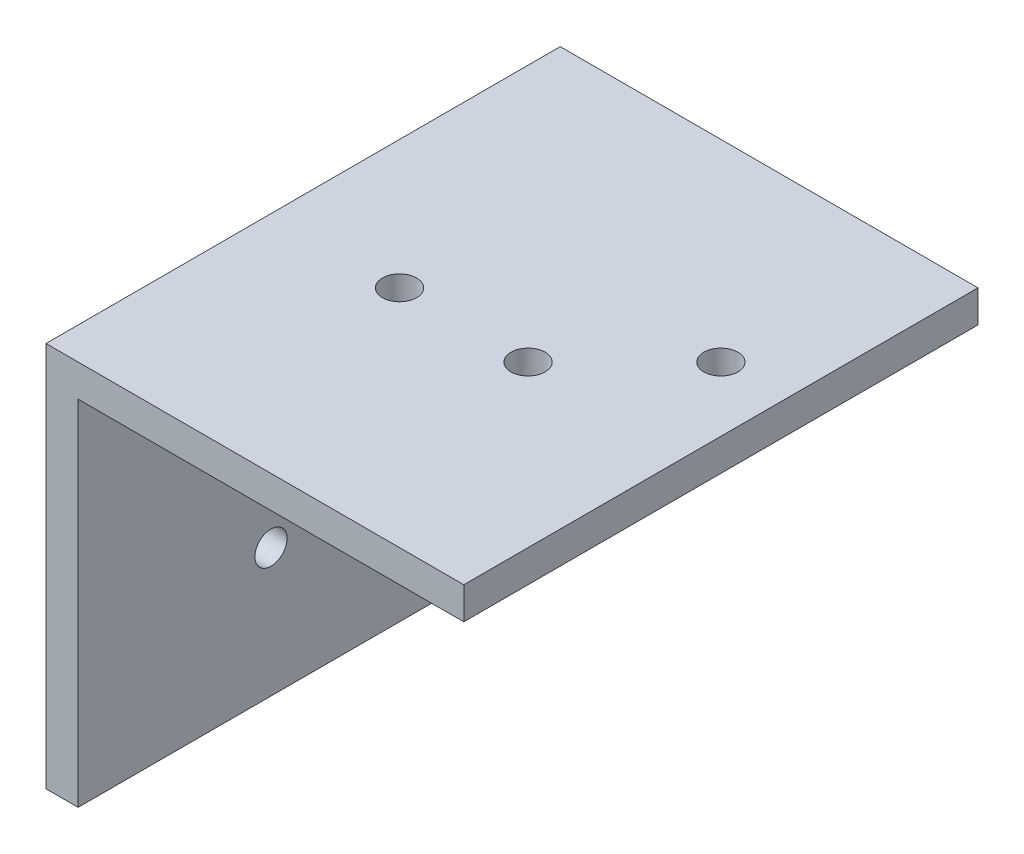
ISO-10303-21;
HEADER;
FILE_DESCRIPTION(('STEP AP214'),'2;1');
FILE_NAME('part.step','',(''),(''),'','','');
FILE_SCHEMA(('AUTOMOTIVE_DESIGN { 1 0 10303 214 1 1 1 1 }'));
ENDSEC;
DATA;
#1=APPLICATION_CONTEXT('core data for automotive mechanical design processes');
#2=APPLICATION_PROTOCOL_DEFINITION('international standard','automotive_design',2000,#1);
#3=PRODUCT_CONTEXT('',#1,'mechanical');
#4=PRODUCT('Part','Part','',(#3));
#5=PRODUCT_RELATED_PRODUCT_CATEGORY('part','',(#4));
#6=PRODUCT_DEFINITION_FORMATION('','',#4);
#7=PRODUCT_DEFINITION_CONTEXT('part definition',#1,'design');
#8=PRODUCT_DEFINITION('design','',#6,#7);
#9=PRODUCT_DEFINITION_SHAPE('','',#8);
#10=(LENGTH_UNIT() NAMED_UNIT(*) SI_UNIT(.MILLI.,.METRE.));
#11=(NAMED_UNIT(*) PLANE_ANGLE_UNIT() SI_UNIT($,.RADIAN.));
#12=(NAMED_UNIT(*) SI_UNIT($,.STERADIAN.) SOLID_ANGLE_UNIT());
#13=UNCERTAINTY_MEASURE_WITH_UNIT(LENGTH_MEASURE(1.E-05),#10,'distance_accuracy_value','');
#14=(GEOMETRIC_REPRESENTATION_CONTEXT(3) GLOBAL_UNCERTAINTY_ASSIGNED_CONTEXT((#13)) GLOBAL_UNIT_ASSIGNED_CONTEXT((#10,
#11,#12)) REPRESENTATION_CONTEXT('',''));
#15=CARTESIAN_POINT('',(0.,0.,0.));
#16=DIRECTION('',(0.,0.,1.));
#17=DIRECTION('',(1.,0.,0.));
#18=AXIS2_PLACEMENT_3D('',#15,#16,#17);
#19=CARTESIAN_POINT('',(33.8636711347438,151.471127611832,-40.704036640267));
#20=DIRECTION('',(0.,-1.,0.));
#21=DIRECTION('',(0.,0.,-1.));
#22=AXIS2_PLACEMENT_3D('',#19,#20,#21);
#23=CYLINDRICAL_SURFACE('',#22,3.3782);
#24=CARTESIAN_POINT('',(33.8636711347438,6.35,-40.704036640267));
#25=DIRECTION('',(0.,-1.,0.));
#26=DIRECTION('',(0.,0.,-1.));
#27=AXIS2_PLACEMENT_3D('',#24,#25,#26);
#28=CIRCLE('',#27,3.3782);
#29=CARTESIAN_POINT('',(33.8636711347438,6.35,-44.082236640267));
#30=VERTEX_POINT('',#29);
#31=EDGE_CURVE('E89',#30,#30,#28,.T.);
#32=ORIENTED_EDGE('',*,*,#31,.F.);
#33=EDGE_LOOP('',(#32));
#34=FACE_BOUND('',#33,.T.);
#35=CARTESIAN_POINT('',(33.8636711347438,0.,-40.704036640267));
#36=DIRECTION('',(0.,1.,0.));
#37=DIRECTION('',(1.,0.,0.));
#38=AXIS2_PLACEMENT_3D('',#35,#36,#37);
#39=CIRCLE('',#38,3.3782);
#40=CARTESIAN_POINT('',(37.2418711347438,0.,-40.704036640267));
#41=VERTEX_POINT('',#40);
#42=EDGE_CURVE('E101',#41,#41,#39,.T.);
#43=ORIENTED_EDGE('',*,*,#42,.F.);
#44=EDGE_LOOP('',(#43));
#45=FACE_BOUND('',#44,.T.);
#46=ADVANCED_FACE('F16',(#34,#45),#23,.F.);
#47=CARTESIAN_POINT('',(14.8136711347438,151.471127611832,-21.654036640267));
#48=DIRECTION('',(0.,-1.,0.));
#49=DIRECTION('',(0.,0.,-1.));
#50=AXIS2_PLACEMENT_3D('',#47,#48,#49);
#51=CYLINDRICAL_SURFACE('',#50,3.3782);
#52=CARTESIAN_POINT('',(14.8136711347438,6.35,-21.654036640267));
#53=DIRECTION('',(0.,-1.,0.));
#54=DIRECTION('',(0.,0.,-1.));
#55=AXIS2_PLACEMENT_3D('',#52,#53,#54);
#56=CIRCLE('',#55,3.3782);
#57=CARTESIAN_POINT('',(14.8136711347438,6.35,-25.032236640267));
#58=VERTEX_POINT('',#57);
#59=EDGE_CURVE('E93',#58,#58,#56,.T.);
#60=ORIENTED_EDGE('',*,*,#59,.F.);
#61=EDGE_LOOP('',(#60));
#62=FACE_BOUND('',#61,.T.);
#63=CARTESIAN_POINT('',(14.8136711347438,0.,-21.654036640267));
#64=DIRECTION('',(0.,1.,0.));
#65=DIRECTION('',(1.,0.,0.));
#66=AXIS2_PLACEMENT_3D('',#63,#64,#65);
#67=CIRCLE('',#66,3.3782);
#68=CARTESIAN_POINT('',(18.1918711347438,0.,-21.654036640267));
#69=VERTEX_POINT('',#68);
#70=EDGE_CURVE('E104',#69,#69,#67,.T.);
#71=ORIENTED_EDGE('',*,*,#70,.F.);
#72=EDGE_LOOP('',(#71));
#73=FACE_BOUND('',#72,.T.);
#74=ADVANCED_FACE('F173',(#62,#73),#51,.F.);
#75=CARTESIAN_POINT('',(-10.5863288652562,151.471127611832,-21.654036640267));
#76=DIRECTION('',(0.,-1.,0.));
#77=DIRECTION('',(0.,0.,-1.));
#78=AXIS2_PLACEMENT_3D('',#75,#76,#77);
#79=CYLINDRICAL_SURFACE('',#78,3.3782);
#80=CARTESIAN_POINT('',(-10.5863288652562,6.35,-21.654036640267));
#81=DIRECTION('',(0.,-1.,0.));
#82=DIRECTION('',(0.,0.,-1.));
#83=AXIS2_PLACEMENT_3D('',#80,#81,#82);
#84=CIRCLE('',#83,3.3782);
#85=CARTESIAN_POINT('',(-10.5863288652562,6.35,-25.032236640267));
#86=VERTEX_POINT('',#85);
#87=EDGE_CURVE('E98',#86,#86,#84,.T.);
#88=ORIENTED_EDGE('',*,*,#87,.F.);
#89=EDGE_LOOP('',(#88));
#90=FACE_BOUND('',#89,.T.);
#91=CARTESIAN_POINT('',(-10.5863288652562,0.,-21.654036640267));
#92=DIRECTION('',(0.,1.,0.));
#93=DIRECTION('',(1.,0.,0.));
#94=AXIS2_PLACEMENT_3D('',#91,#92,#93);
#95=CIRCLE('',#94,3.3782);
#96=CARTESIAN_POINT('',(-7.20812886525619,0.,-21.654036640267));
#97=VERTEX_POINT('',#96);
#98=EDGE_CURVE('E108',#97,#97,#95,.T.);
#99=ORIENTED_EDGE('',*,*,#98,.F.);
#100=EDGE_LOOP('',(#99));
#101=FACE_BOUND('',#100,.T.);
#102=ADVANCED_FACE('F179',(#90,#101),#79,.F.);
#103=CARTESIAN_POINT('',(-29.6363288652562,-19.05,-28.004036640267));
#104=DIRECTION('',(-1.,0.,0.));
#105=DIRECTION('',(0.,0.,1.));
#106=AXIS2_PLACEMENT_3D('',#103,#104,#105);
#107=CYLINDRICAL_SURFACE('',#106,3.175);
#108=CARTESIAN_POINT('',(-35.9863288652562,-19.05,-28.004036640267));
#109=DIRECTION('',(1.,0.,0.));
#110=DIRECTION('',(0.,1.,0.));
#111=AXIS2_PLACEMENT_3D('',#108,#109,#110);
#112=CIRCLE('',#111,3.175);
#113=CARTESIAN_POINT('',(-35.9863288652562,-15.875,-28.004036640267));
#114=VERTEX_POINT('',#113);
#115=EDGE_CURVE('E114',#114,#114,#112,.T.);
#116=ORIENTED_EDGE('',*,*,#115,.F.);
#117=EDGE_LOOP('',(#116));
#118=FACE_BOUND('',#117,.T.);
#119=CARTESIAN_POINT('',(-29.6363288652562,-19.05,-28.004036640267));
#120=DIRECTION('',(-1.,0.,0.));
#121=DIRECTION('',(0.,1.,0.));
#122=AXIS2_PLACEMENT_3D('',#119,#120,#121);
#123=CIRCLE('',#122,3.175);
#124=CARTESIAN_POINT('',(-29.6363288652562,-15.875,-28.004036640267));
#125=VERTEX_POINT('',#124);
#126=EDGE_CURVE('E77',#125,#125,#123,.T.);
#127=ORIENTED_EDGE('',*,*,#126,.F.);
#128=EDGE_LOOP('',(#127));
#129=FACE_BOUND('',#128,.T.);
#130=ADVANCED_FACE('F169',(#118,#129),#107,.F.);
#131=CARTESIAN_POINT('',(-29.6363288652562,-44.45,-15.304036640267));
#132=DIRECTION('',(-1.,0.,0.));
#133=DIRECTION('',(0.,1.,0.));
#134=AXIS2_PLACEMENT_3D('',#131,#132,#133);
#135=CYLINDRICAL_SURFACE('',#134,3.175);
#136=CARTESIAN_POINT('',(-35.9863288652562,-44.45,-15.304036640267));
#137=DIRECTION('',(1.,0.,0.));
#138=DIRECTION('',(0.,1.,0.));
#139=AXIS2_PLACEMENT_3D('',#136,#137,#138);
#140=CIRCLE('',#139,3.175);
#141=CARTESIAN_POINT('',(-35.9863288652562,-41.275,-15.304036640267));
#142=VERTEX_POINT('',#141);
#143=EDGE_CURVE('E118',#142,#142,#140,.T.);
#144=ORIENTED_EDGE('',*,*,#143,.F.);
#145=EDGE_LOOP('',(#144));
#146=FACE_BOUND('',#145,.T.);
#147=CARTESIAN_POINT('',(-29.6363288652562,-44.45,-15.304036640267));
#148=DIRECTION('',(-1.,0.,0.));
#149=DIRECTION('',(0.,1.,0.));
#150=AXIS2_PLACEMENT_3D('',#147,#148,#149);
#151=CIRCLE('',#150,3.175);
#152=CARTESIAN_POINT('',(-29.6363288652562,-41.275,-15.304036640267));
#153=VERTEX_POINT('',#152);
#154=EDGE_CURVE('E117',#153,#153,#151,.T.);
#155=ORIENTED_EDGE('',*,*,#154,.F.);
#156=EDGE_LOOP('',(#155));
#157=FACE_BOUND('',#156,.T.);
#158=ADVANCED_FACE('F18',(#146,#157),#135,.F.);
#159=CARTESIAN_POINT('',(-11.4753288652562,-14.986,22.795963359733));
#160=DIRECTION('',(0.,0.,1.));
#161=DIRECTION('',(1.,0.,0.));
#162=AXIS2_PLACEMENT_3D('',#159,#160,#161);
#163=PLANE('',#162);
#164=DIRECTION('',(1.,0.,0.));
#165=VECTOR('',#164,1.);
#166=CARTESIAN_POINT('',(-29.6363288652562,0.,22.795963359733));
#167=LINE('',#166,#165);
#168=CARTESIAN_POINT('',(-29.6363288652562,0.,22.795963359733));
#169=VERTEX_POINT('',#168);
#170=CARTESIAN_POINT('',(46.5636711347438,0.,22.795963359733));
#171=VERTEX_POINT('',#170);
#172=EDGE_CURVE('E11',#169,#171,#167,.T.);
#173=ORIENTED_EDGE('',*,*,#172,.T.);
#174=DIRECTION('',(0.,1.,0.));
#175=VECTOR('',#174,1.);
#176=CARTESIAN_POINT('',(46.5636711347438,0.,22.795963359733));
#177=LINE('',#176,#175);
#178=CARTESIAN_POINT('',(46.5636711347438,6.35,22.795963359733));
#179=VERTEX_POINT('',#178);
#180=EDGE_CURVE('E26',#171,#179,#177,.T.);
#181=ORIENTED_EDGE('',*,*,#180,.T.);
#182=DIRECTION('',(-1.,0.,0.));
#183=VECTOR('',#182,1.);
#184=CARTESIAN_POINT('',(46.5636711347438,6.35,22.795963359733));
#185=LINE('',#184,#183);
#186=CARTESIAN_POINT('',(-35.9863288652562,6.35,22.795963359733));
#187=VERTEX_POINT('',#186);
#188=EDGE_CURVE('E87',#179,#187,#185,.T.);
#189=ORIENTED_EDGE('',*,*,#188,.T.);
#190=DIRECTION('',(0.,-1.,0.));
#191=VECTOR('',#190,1.);
#192=CARTESIAN_POINT('',(-35.9863288652562,6.35,22.795963359733));
#193=LINE('',#192,#191);
#194=CARTESIAN_POINT('',(-35.9863288652562,-69.85,22.795963359733));
#195=VERTEX_POINT('',#194);
#196=EDGE_CURVE('E127',#187,#195,#193,.T.);
#197=ORIENTED_EDGE('',*,*,#196,.T.);
#198=DIRECTION('',(1.,0.,0.));
#199=VECTOR('',#198,1.);
#200=CARTESIAN_POINT('',(-35.9863288652562,-69.85,22.795963359733));
#201=LINE('',#200,#199);
#202=CARTESIAN_POINT('',(-29.6363288652562,-69.85,22.795963359733));
#203=VERTEX_POINT('',#202);
#204=EDGE_CURVE('E130',#195,#203,#201,.T.);
#205=ORIENTED_EDGE('',*,*,#204,.T.);
#206=DIRECTION('',(0.,1.,0.));
#207=VECTOR('',#206,1.);
#208=CARTESIAN_POINT('',(-29.6363288652562,-69.85,22.795963359733));
#209=LINE('',#208,#207);
#210=EDGE_CURVE('E133',#203,#169,#209,.T.);
#211=ORIENTED_EDGE('',*,*,#210,.T.);
#212=EDGE_LOOP('',(#173,#181,#189,#197,#205,#211));
#213=FACE_BOUND('',#212,.T.);
#214=ADVANCED_FACE('F160',(#213),#163,.T.);
#215=CARTESIAN_POINT('',(-32.8113288652562,-69.85,-34.354036640267));
#216=DIRECTION('',(0.,1.,0.));
#217=DIRECTION('',(0.,0.,1.));
#218=AXIS2_PLACEMENT_3D('',#215,#216,#217);
#219=PLANE('',#218);
#220=DIRECTION('',(0.,0.,1.));
#221=VECTOR('',#220,1.);
#222=CARTESIAN_POINT('',(-29.6363288652562,-69.85,-78.804036640267));
#223=LINE('',#222,#221);
#224=CARTESIAN_POINT('',(-29.6363288652562,-69.85,-78.804036640267));
#225=VERTEX_POINT('',#224);
#226=EDGE_CURVE('E136',#225,#203,#223,.T.);
#227=ORIENTED_EDGE('',*,*,#226,.T.);
#228=ORIENTED_EDGE('',*,*,#204,.F.);
#229=DIRECTION('',(0.,0.,1.));
#230=VECTOR('',#229,1.);
#231=CARTESIAN_POINT('',(-35.9863288652562,-69.85,10.095963359733));
#232=LINE('',#231,#230);
#233=CARTESIAN_POINT('',(-35.9863288652562,-69.85,-78.804036640267));
#234=VERTEX_POINT('',#233);
#235=EDGE_CURVE('E88',#234,#195,#232,.T.);
#236=ORIENTED_EDGE('',*,*,#235,.F.);
#237=DIRECTION('',(1.,0.,0.));
#238=VECTOR('',#237,1.);
#239=CARTESIAN_POINT('',(-35.9863288652562,-69.85,-78.804036640267));
#240=LINE('',#239,#238);
#241=EDGE_CURVE('E138',#234,#225,#240,.T.);
#242=ORIENTED_EDGE('',*,*,#241,.T.);
#243=EDGE_LOOP('',(#227,#228,#236,#242));
#244=FACE_BOUND('',#243,.T.);
#245=ADVANCED_FACE('F156',(#244),#219,.F.);
#246=CARTESIAN_POINT('',(-7.41132886525619,-6.35,-78.804036640267));
#247=DIRECTION('',(0.,0.,1.));
#248=DIRECTION('',(1.,0.,0.));
#249=AXIS2_PLACEMENT_3D('',#246,#247,#248);
#250=PLANE('',#249);
#251=DIRECTION('',(-1.,0.,0.));
#252=VECTOR('',#251,1.);
#253=CARTESIAN_POINT('',(46.5636711347438,0.,-78.804036640267));
#254=LINE('',#253,#252);
#255=CARTESIAN_POINT('',(46.5636711347438,0.,-78.804036640267));
#256=VERTEX_POINT('',#255);
#257=CARTESIAN_POINT('',(-29.6363288652562,0.,-78.804036640267));
#258=VERTEX_POINT('',#257);
#259=EDGE_CURVE('E141',#256,#258,#254,.T.);
#260=ORIENTED_EDGE('',*,*,#259,.T.);
#261=DIRECTION('',(0.,-1.,0.));
#262=VECTOR('',#261,1.);
#263=CARTESIAN_POINT('',(-29.6363288652562,0.,-78.804036640267));
#264=LINE('',#263,#262);
#265=EDGE_CURVE('E83',#258,#225,#264,.T.);
#266=ORIENTED_EDGE('',*,*,#265,.T.);
#267=ORIENTED_EDGE('',*,*,#241,.F.);
#268=DIRECTION('',(0.,-1.,0.));
#269=VECTOR('',#268,1.);
#270=CARTESIAN_POINT('',(-35.9863288652562,-44.45,-78.804036640267));
#271=LINE('',#270,#269);
#272=CARTESIAN_POINT('',(-35.9863288652562,6.35,-78.804036640267));
#273=VERTEX_POINT('',#272);
#274=EDGE_CURVE('E66',#273,#234,#271,.T.);
#275=ORIENTED_EDGE('',*,*,#274,.F.);
#276=DIRECTION('',(1.,0.,0.));
#277=VECTOR('',#276,1.);
#278=CARTESIAN_POINT('',(-35.9863288652562,6.35,-78.804036640267));
#279=LINE('',#278,#277);
#280=CARTESIAN_POINT('',(46.5636711347438,6.35,-78.804036640267));
#281=VERTEX_POINT('',#280);
#282=EDGE_CURVE('E76',#273,#281,#279,.T.);
#283=ORIENTED_EDGE('',*,*,#282,.T.);
#284=DIRECTION('',(0.,-1.,0.));
#285=VECTOR('',#284,1.);
#286=CARTESIAN_POINT('',(46.5636711347438,6.35,-78.804036640267));
#287=LINE('',#286,#285);
#288=EDGE_CURVE('E69',#281,#256,#287,.T.);
#289=ORIENTED_EDGE('',*,*,#288,.T.);
#290=EDGE_LOOP('',(#260,#266,#267,#275,#283,#289));
#291=FACE_BOUND('',#290,.T.);
#292=ADVANCED_FACE('F79',(#291),#250,.F.);
#293=CARTESIAN_POINT('',(-29.6363288652562,-19.05,-21.654036640267));
#294=DIRECTION('',(1.,0.,0.));
#295=DIRECTION('',(0.,0.,-1.));
#296=AXIS2_PLACEMENT_3D('',#293,#294,#295);
#297=PLANE('',#296);
#298=ORIENTED_EDGE('',*,*,#126,.T.);
#299=EDGE_LOOP('',(#298));
#300=FACE_BOUND('',#299,.T.);
#301=ORIENTED_EDGE('',*,*,#154,.T.);
#302=EDGE_LOOP('',(#301));
#303=FACE_BOUND('',#302,.T.);
#304=DIRECTION('',(0.,0.,-1.));
#305=VECTOR('',#304,1.);
#306=CARTESIAN_POINT('',(-29.6363288652562,0.,10.095963359733));
#307=LINE('',#306,#305);
#308=EDGE_CURVE('E113',#169,#258,#307,.T.);
#309=ORIENTED_EDGE('',*,*,#308,.F.);
#310=ORIENTED_EDGE('',*,*,#210,.F.);
#311=ORIENTED_EDGE('',*,*,#226,.F.);
#312=ORIENTED_EDGE('',*,*,#265,.F.);
#313=EDGE_LOOP('',(#309,#310,#311,#312));
#314=FACE_BOUND('',#313,.T.);
#315=ADVANCED_FACE('F154',(#300,#303,#314),#297,.T.);
#316=CARTESIAN_POINT('',(-35.9863288652562,-19.05,-21.654036640267));
#317=DIRECTION('',(1.,0.,0.));
#318=DIRECTION('',(0.,0.,-1.));
#319=AXIS2_PLACEMENT_3D('',#316,#317,#318);
#320=PLANE('',#319);
#321=ORIENTED_EDGE('',*,*,#115,.T.);
#322=EDGE_LOOP('',(#321));
#323=FACE_BOUND('',#322,.T.);
#324=ORIENTED_EDGE('',*,*,#143,.T.);
#325=EDGE_LOOP('',(#324));
#326=FACE_BOUND('',#325,.T.);
#327=DIRECTION('',(0.,0.,1.));
#328=VECTOR('',#327,1.);
#329=CARTESIAN_POINT('',(-35.9863288652562,6.35,10.095963359733));
#330=LINE('',#329,#328);
#331=EDGE_CURVE('E103',#273,#187,#330,.T.);
#332=ORIENTED_EDGE('',*,*,#331,.F.);
#333=ORIENTED_EDGE('',*,*,#274,.T.);
#334=ORIENTED_EDGE('',*,*,#235,.T.);
#335=ORIENTED_EDGE('',*,*,#196,.F.);
#336=EDGE_LOOP('',(#332,#333,#334,#335));
#337=FACE_BOUND('',#336,.T.);
#338=ADVANCED_FACE('F158',(#323,#326,#337),#320,.F.);
#339=CARTESIAN_POINT('',(46.5636711347438,0.,10.095963359733));
#340=DIRECTION('',(1.,0.,0.));
#341=DIRECTION('',(0.,0.,-1.));
#342=AXIS2_PLACEMENT_3D('',#339,#340,#341);
#343=PLANE('',#342);
#344=DIRECTION('',(0.,0.,1.));
#345=VECTOR('',#344,1.);
#346=CARTESIAN_POINT('',(46.5636711347438,0.,10.095963359733));
#347=LINE('',#346,#345);
#348=EDGE_CURVE('E73',#256,#171,#347,.T.);
#349=ORIENTED_EDGE('',*,*,#348,.F.);
#350=ORIENTED_EDGE('',*,*,#288,.F.);
#351=DIRECTION('',(0.,0.,1.));
#352=VECTOR('',#351,1.);
#353=CARTESIAN_POINT('',(46.5636711347438,6.35,10.095963359733));
#354=LINE('',#353,#352);
#355=EDGE_CURVE('E20',#281,#179,#354,.T.);
#356=ORIENTED_EDGE('',*,*,#355,.T.);
#357=ORIENTED_EDGE('',*,*,#180,.F.);
#358=EDGE_LOOP('',(#349,#350,#356,#357));
#359=FACE_BOUND('',#358,.T.);
#360=ADVANCED_FACE('F70',(#359),#343,.T.);
#361=CARTESIAN_POINT('',(8.46367113474381,6.35,-21.654036640267));
#362=DIRECTION('',(0.,-1.,0.));
#363=DIRECTION('',(0.,0.,-1.));
#364=AXIS2_PLACEMENT_3D('',#361,#362,#363);
#365=PLANE('',#364);
#366=ORIENTED_EDGE('',*,*,#31,.T.);
#367=EDGE_LOOP('',(#366));
#368=FACE_BOUND('',#367,.T.);
#369=ORIENTED_EDGE('',*,*,#59,.T.);
#370=EDGE_LOOP('',(#369));
#371=FACE_BOUND('',#370,.T.);
#372=ORIENTED_EDGE('',*,*,#87,.T.);
#373=EDGE_LOOP('',(#372));
#374=FACE_BOUND('',#373,.T.);
#375=ORIENTED_EDGE('',*,*,#355,.F.);
#376=ORIENTED_EDGE('',*,*,#282,.F.);
#377=ORIENTED_EDGE('',*,*,#331,.T.);
#378=ORIENTED_EDGE('',*,*,#188,.F.);
#379=EDGE_LOOP('',(#375,#376,#377,#378));
#380=FACE_BOUND('',#379,.T.);
#381=ADVANCED_FACE('F85',(#368,#371,#374,#380),#365,.F.);
#382=CARTESIAN_POINT('',(8.46367113474381,0.,-21.654036640267));
#383=DIRECTION('',(0.,-1.,0.));
#384=DIRECTION('',(0.,0.,-1.));
#385=AXIS2_PLACEMENT_3D('',#382,#383,#384);
#386=PLANE('',#385);
#387=ORIENTED_EDGE('',*,*,#42,.T.);
#388=EDGE_LOOP('',(#387));
#389=FACE_BOUND('',#388,.T.);
#390=ORIENTED_EDGE('',*,*,#70,.T.);
#391=EDGE_LOOP('',(#390));
#392=FACE_BOUND('',#391,.T.);
#393=ORIENTED_EDGE('',*,*,#98,.T.);
#394=EDGE_LOOP('',(#393));
#395=FACE_BOUND('',#394,.T.);
#396=ORIENTED_EDGE('',*,*,#308,.T.);
#397=ORIENTED_EDGE('',*,*,#259,.F.);
#398=ORIENTED_EDGE('',*,*,#348,.T.);
#399=ORIENTED_EDGE('',*,*,#172,.F.);
#400=EDGE_LOOP('',(#396,#397,#398,#399));
#401=FACE_BOUND('',#400,.T.);
#402=ADVANCED_FACE('F150',(#389,#392,#395,#401),#386,.T.);
#403=CLOSED_SHELL('',(#46,#74,#102,#130,#158,#214,#245,#292,#315,#338,#360,#381,#402));
#404=MANIFOLD_SOLID_BREP('B1',#403);
#405=ADVANCED_BREP_SHAPE_REPRESENTATION('',(#18,#404),#14);
#406=SHAPE_DEFINITION_REPRESENTATION(#9,#405);
ENDSEC;
END-ISO-10303-21;
